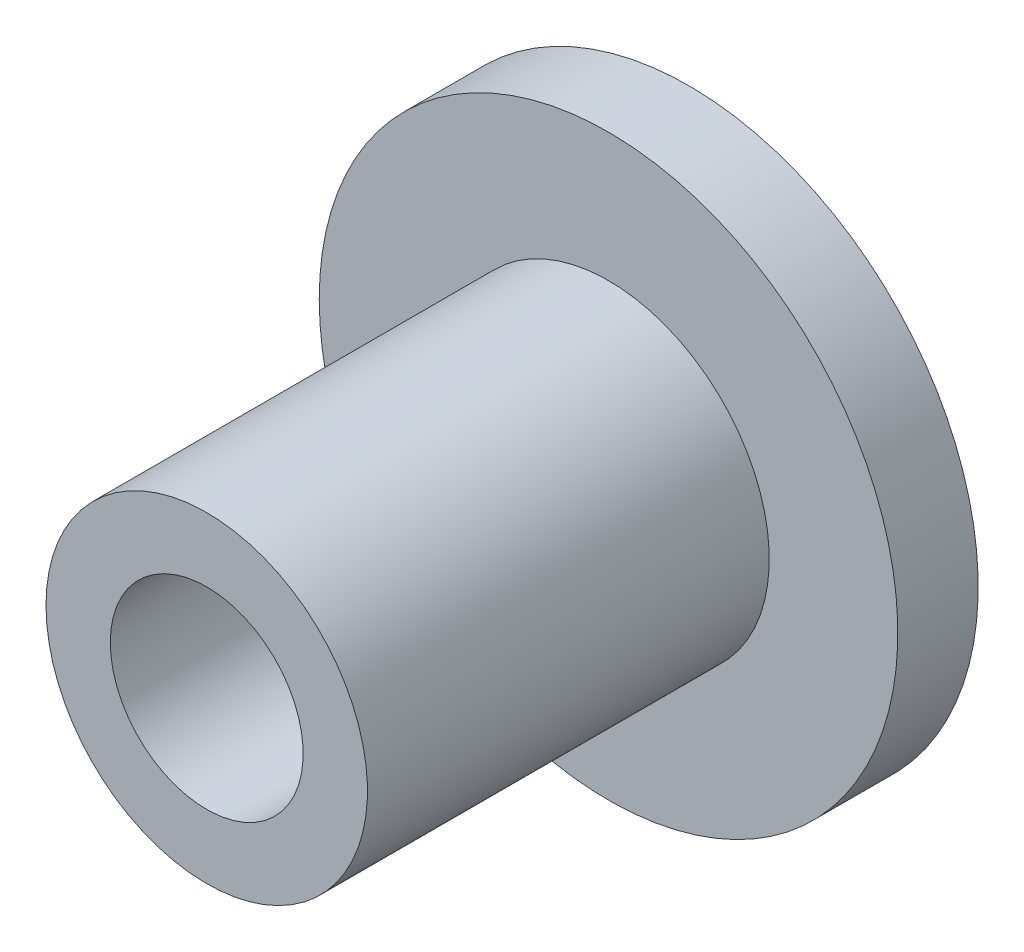
ISO-10303-21;
HEADER;
FILE_DESCRIPTION(('STEP AP214'),'2;1');
FILE_NAME('part.step','',(''),(''),'','','');
FILE_SCHEMA(('AUTOMOTIVE_DESIGN { 1 0 10303 214 1 1 1 1 }'));
ENDSEC;
DATA;
#1=APPLICATION_CONTEXT('core data for automotive mechanical design processes');
#2=APPLICATION_PROTOCOL_DEFINITION('international standard','automotive_design',2000,#1);
#3=PRODUCT_CONTEXT('',#1,'mechanical');
#4=PRODUCT('Part','Part','',(#3));
#5=PRODUCT_RELATED_PRODUCT_CATEGORY('part','',(#4));
#6=PRODUCT_DEFINITION_FORMATION('','',#4);
#7=PRODUCT_DEFINITION_CONTEXT('part definition',#1,'design');
#8=PRODUCT_DEFINITION('design','',#6,#7);
#9=PRODUCT_DEFINITION_SHAPE('','',#8);
#10=(LENGTH_UNIT() NAMED_UNIT(*) SI_UNIT(.MILLI.,.METRE.));
#11=(NAMED_UNIT(*) PLANE_ANGLE_UNIT() SI_UNIT($,.RADIAN.));
#12=(NAMED_UNIT(*) SI_UNIT($,.STERADIAN.) SOLID_ANGLE_UNIT());
#13=UNCERTAINTY_MEASURE_WITH_UNIT(LENGTH_MEASURE(1.E-05),#10,'distance_accuracy_value','');
#14=(GEOMETRIC_REPRESENTATION_CONTEXT(3) GLOBAL_UNCERTAINTY_ASSIGNED_CONTEXT((#13)) GLOBAL_UNIT_ASSIGNED_CONTEXT((#10,
#11,#12)) REPRESENTATION_CONTEXT('',''));
#15=CARTESIAN_POINT('',(0.,0.,0.));
#16=DIRECTION('',(0.,0.,1.));
#17=DIRECTION('',(1.,0.,0.));
#18=AXIS2_PLACEMENT_3D('',#15,#16,#17);
#19=CARTESIAN_POINT('',(0.,0.,0.));
#20=DIRECTION('',(0.,0.,-1.));
#21=DIRECTION('',(-1.,0.,0.));
#22=AXIS2_PLACEMENT_3D('',#19,#20,#21);
#23=CYLINDRICAL_SURFACE('',#22,6.);
#24=CARTESIAN_POINT('',(0.,0.,30.));
#25=DIRECTION('',(0.,0.,-1.));
#26=DIRECTION('',(-1.,0.,0.));
#27=AXIS2_PLACEMENT_3D('',#24,#25,#26);
#28=CIRCLE('',#27,6.);
#29=CARTESIAN_POINT('',(-6.,0.,30.));
#30=VERTEX_POINT('',#29);
#31=EDGE_CURVE('E77',#30,#30,#28,.T.);
#32=ORIENTED_EDGE('',*,*,#31,.F.);
#33=EDGE_LOOP('',(#32));
#34=FACE_BOUND('',#33,.T.);
#35=CARTESIAN_POINT('',(0.,0.,0.));
#36=DIRECTION('',(0.,0.,-1.));
#37=DIRECTION('',(-1.,0.,0.));
#38=AXIS2_PLACEMENT_3D('',#35,#36,#37);
#39=CIRCLE('',#38,6.);
#40=CARTESIAN_POINT('',(-6.,0.,0.));
#41=VERTEX_POINT('',#40);
#42=EDGE_CURVE('E10',#41,#41,#39,.T.);
#43=ORIENTED_EDGE('',*,*,#42,.T.);
#44=EDGE_LOOP('',(#43));
#45=FACE_BOUND('',#44,.T.);
#46=ADVANCED_FACE('F49',(#34,#45),#23,.F.);
#47=CARTESIAN_POINT('',(6.,0.,0.));
#48=DIRECTION('',(0.,0.,1.));
#49=DIRECTION('',(1.,0.,0.));
#50=AXIS2_PLACEMENT_3D('',#47,#48,#49);
#51=PLANE('',#50);
#52=ORIENTED_EDGE('',*,*,#42,.F.);
#53=EDGE_LOOP('',(#52));
#54=FACE_BOUND('',#53,.T.);
#55=CARTESIAN_POINT('',(0.,0.,0.));
#56=DIRECTION('',(0.,0.,-1.));
#57=DIRECTION('',(-1.,0.,0.));
#58=AXIS2_PLACEMENT_3D('',#55,#56,#57);
#59=CIRCLE('',#58,18.);
#60=CARTESIAN_POINT('',(-18.,0.,0.));
#61=VERTEX_POINT('',#60);
#62=EDGE_CURVE('E57',#61,#61,#59,.T.);
#63=ORIENTED_EDGE('',*,*,#62,.T.);
#64=EDGE_LOOP('',(#63));
#65=FACE_BOUND('',#64,.T.);
#66=ADVANCED_FACE('F85',(#54,#65),#51,.F.);
#67=CARTESIAN_POINT('',(0.,0.,0.));
#68=DIRECTION('',(0.,0.,-1.));
#69=DIRECTION('',(-1.,0.,0.));
#70=AXIS2_PLACEMENT_3D('',#67,#68,#69);
#71=CYLINDRICAL_SURFACE('',#70,18.);
#72=ORIENTED_EDGE('',*,*,#62,.F.);
#73=EDGE_LOOP('',(#72));
#74=FACE_BOUND('',#73,.T.);
#75=CARTESIAN_POINT('',(0.,0.,5.));
#76=DIRECTION('',(0.,0.,-1.));
#77=DIRECTION('',(-1.,0.,0.));
#78=AXIS2_PLACEMENT_3D('',#75,#76,#77);
#79=CIRCLE('',#78,18.);
#80=CARTESIAN_POINT('',(-18.,0.,5.));
#81=VERTEX_POINT('',#80);
#82=EDGE_CURVE('E64',#81,#81,#79,.T.);
#83=ORIENTED_EDGE('',*,*,#82,.T.);
#84=EDGE_LOOP('',(#83));
#85=FACE_BOUND('',#84,.T.);
#86=ADVANCED_FACE('F88',(#74,#85),#71,.T.);
#87=CARTESIAN_POINT('',(18.,0.,5.));
#88=DIRECTION('',(0.,0.,-1.));
#89=DIRECTION('',(-1.,0.,0.));
#90=AXIS2_PLACEMENT_3D('',#87,#88,#89);
#91=PLANE('',#90);
#92=ORIENTED_EDGE('',*,*,#82,.F.);
#93=EDGE_LOOP('',(#92));
#94=FACE_BOUND('',#93,.T.);
#95=CARTESIAN_POINT('',(0.,0.,5.));
#96=DIRECTION('',(0.,0.,-1.));
#97=DIRECTION('',(-1.,0.,0.));
#98=AXIS2_PLACEMENT_3D('',#95,#96,#97);
#99=CIRCLE('',#98,10.);
#100=CARTESIAN_POINT('',(-10.,0.,5.));
#101=VERTEX_POINT('',#100);
#102=EDGE_CURVE('E69',#101,#101,#99,.T.);
#103=ORIENTED_EDGE('',*,*,#102,.T.);
#104=EDGE_LOOP('',(#103));
#105=FACE_BOUND('',#104,.T.);
#106=ADVANCED_FACE('F92',(#94,#105),#91,.F.);
#107=CARTESIAN_POINT('',(0.,0.,0.));
#108=DIRECTION('',(0.,0.,-1.));
#109=DIRECTION('',(-1.,0.,0.));
#110=AXIS2_PLACEMENT_3D('',#107,#108,#109);
#111=CYLINDRICAL_SURFACE('',#110,10.);
#112=ORIENTED_EDGE('',*,*,#102,.F.);
#113=EDGE_LOOP('',(#112));
#114=FACE_BOUND('',#113,.T.);
#115=CARTESIAN_POINT('',(0.,0.,30.));
#116=DIRECTION('',(0.,0.,-1.));
#117=DIRECTION('',(-1.,0.,0.));
#118=AXIS2_PLACEMENT_3D('',#115,#116,#117);
#119=CIRCLE('',#118,10.);
#120=CARTESIAN_POINT('',(-10.,0.,30.));
#121=VERTEX_POINT('',#120);
#122=EDGE_CURVE('E74',#121,#121,#119,.T.);
#123=ORIENTED_EDGE('',*,*,#122,.T.);
#124=EDGE_LOOP('',(#123));
#125=FACE_BOUND('',#124,.T.);
#126=ADVANCED_FACE('F102',(#114,#125),#111,.T.);
#127=CARTESIAN_POINT('',(10.,0.,30.));
#128=DIRECTION('',(0.,0.,-1.));
#129=DIRECTION('',(-1.,0.,0.));
#130=AXIS2_PLACEMENT_3D('',#127,#128,#129);
#131=PLANE('',#130);
#132=ORIENTED_EDGE('',*,*,#122,.F.);
#133=EDGE_LOOP('',(#132));
#134=FACE_BOUND('',#133,.T.);
#135=ORIENTED_EDGE('',*,*,#31,.T.);
#136=EDGE_LOOP('',(#135));
#137=FACE_BOUND('',#136,.T.);
#138=ADVANCED_FACE('F82',(#134,#137),#131,.F.);
#139=CLOSED_SHELL('',(#46,#66,#86,#106,#126,#138));
#140=MANIFOLD_SOLID_BREP('B2',#139);
#141=ADVANCED_BREP_SHAPE_REPRESENTATION('',(#18,#140),#14);
#142=SHAPE_DEFINITION_REPRESENTATION(#9,#141);
ENDSEC;
END-ISO-10303-21;
